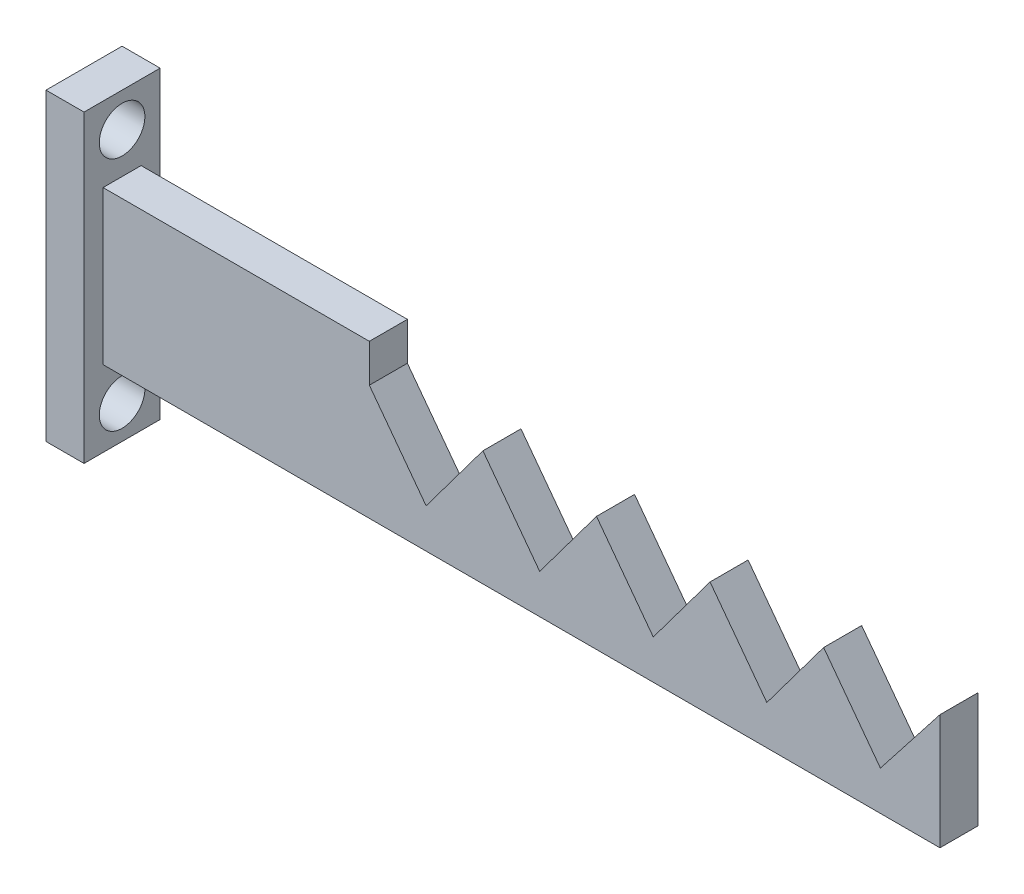
ISO-10303-21;
HEADER;
FILE_DESCRIPTION(('STEP AP214'),'2;1');
FILE_NAME('part.step','',(''),(''),'','','');
FILE_SCHEMA(('AUTOMOTIVE_DESIGN { 1 0 10303 214 1 1 1 1 }'));
ENDSEC;
DATA;
#1=APPLICATION_CONTEXT('core data for automotive mechanical design processes');
#2=APPLICATION_PROTOCOL_DEFINITION('international standard','automotive_design',2000,#1);
#3=PRODUCT_CONTEXT('',#1,'mechanical');
#4=PRODUCT('Part','Part','',(#3));
#5=PRODUCT_RELATED_PRODUCT_CATEGORY('part','',(#4));
#6=PRODUCT_DEFINITION_FORMATION('','',#4);
#7=PRODUCT_DEFINITION_CONTEXT('part definition',#1,'design');
#8=PRODUCT_DEFINITION('design','',#6,#7);
#9=PRODUCT_DEFINITION_SHAPE('','',#8);
#10=(LENGTH_UNIT() NAMED_UNIT(*) SI_UNIT(.MILLI.,.METRE.));
#11=(NAMED_UNIT(*) PLANE_ANGLE_UNIT() SI_UNIT($,.RADIAN.));
#12=(NAMED_UNIT(*) SI_UNIT($,.STERADIAN.) SOLID_ANGLE_UNIT());
#13=UNCERTAINTY_MEASURE_WITH_UNIT(LENGTH_MEASURE(1.E-05),#10,'distance_accuracy_value','');
#14=(GEOMETRIC_REPRESENTATION_CONTEXT(3) GLOBAL_UNCERTAINTY_ASSIGNED_CONTEXT((#13)) GLOBAL_UNIT_ASSIGNED_CONTEXT((#10,
#11,#12)) REPRESENTATION_CONTEXT('',''));
#15=CARTESIAN_POINT('',(0.,0.,0.));
#16=DIRECTION('',(0.,0.,1.));
#17=DIRECTION('',(1.,0.,0.));
#18=AXIS2_PLACEMENT_3D('',#15,#16,#17);
#19=CARTESIAN_POINT('',(-8.89,-2.62039665608065,2.54));
#20=DIRECTION('',(0.,1.,0.));
#21=DIRECTION('',(0.,0.,1.));
#22=AXIS2_PLACEMENT_3D('',#19,#20,#21);
#23=PLANE('',#22);
#24=DIRECTION('',(1.,0.,0.));
#25=VECTOR('',#24,1.);
#26=CARTESIAN_POINT('',(-8.89,-2.62039665608065,0.));
#27=LINE('',#26,#25);
#28=CARTESIAN_POINT('',(-8.89,-2.62039665608065,0.));
#29=VERTEX_POINT('',#28);
#30=CARTESIAN_POINT('',(46.99,-2.62039665608065,0.));
#31=VERTEX_POINT('',#30);
#32=EDGE_CURVE('E184',#29,#31,#27,.T.);
#33=ORIENTED_EDGE('',*,*,#32,.T.);
#34=DIRECTION('',(0.,0.,-1.));
#35=VECTOR('',#34,1.);
#36=CARTESIAN_POINT('',(46.99,-2.62039665608065,2.54));
#37=LINE('',#36,#35);
#38=CARTESIAN_POINT('',(46.99,-2.62039665608065,2.54));
#39=VERTEX_POINT('',#38);
#40=EDGE_CURVE('E53',#39,#31,#37,.T.);
#41=ORIENTED_EDGE('',*,*,#40,.F.);
#42=DIRECTION('',(1.,0.,0.));
#43=VECTOR('',#42,1.);
#44=CARTESIAN_POINT('',(-8.89,-2.62039665608065,2.54));
#45=LINE('',#44,#43);
#46=CARTESIAN_POINT('',(-8.89,-2.62039665608065,2.54));
#47=VERTEX_POINT('',#46);
#48=EDGE_CURVE('E123',#47,#39,#45,.T.);
#49=ORIENTED_EDGE('',*,*,#48,.F.);
#50=DIRECTION('',(0.,0.,-1.));
#51=VECTOR('',#50,1.);
#52=CARTESIAN_POINT('',(-8.89,-2.62039665608065,2.54));
#53=LINE('',#52,#51);
#54=EDGE_CURVE('E11',#47,#29,#53,.T.);
#55=ORIENTED_EDGE('',*,*,#54,.T.);
#56=EDGE_LOOP('',(#33,#41,#49,#55));
#57=FACE_BOUND('',#56,.T.);
#58=ADVANCED_FACE('F44',(#57),#23,.F.);
#59=CARTESIAN_POINT('',(46.99,5.07999999999997,2.54));
#60=DIRECTION('',(-1.,0.,0.));
#61=DIRECTION('',(0.,-1.,0.));
#62=AXIS2_PLACEMENT_3D('',#59,#60,#61);
#63=PLANE('',#62);
#64=DIRECTION('',(0.,1.,0.));
#65=VECTOR('',#64,1.);
#66=CARTESIAN_POINT('',(46.99,5.07999999999997,0.));
#67=LINE('',#66,#65);
#68=CARTESIAN_POINT('',(46.99,5.07999999999997,0.));
#69=VERTEX_POINT('',#68);
#70=EDGE_CURVE('E187',#31,#69,#67,.T.);
#71=ORIENTED_EDGE('',*,*,#70,.T.);
#72=DIRECTION('',(0.,0.,-1.));
#73=VECTOR('',#72,1.);
#74=CARTESIAN_POINT('',(46.99,5.07999999999997,2.54));
#75=LINE('',#74,#73);
#76=CARTESIAN_POINT('',(46.99,5.07999999999997,2.54));
#77=VERTEX_POINT('',#76);
#78=EDGE_CURVE('E271',#77,#69,#75,.T.);
#79=ORIENTED_EDGE('',*,*,#78,.F.);
#80=DIRECTION('',(0.,1.,0.));
#81=VECTOR('',#80,1.);
#82=CARTESIAN_POINT('',(46.99,-2.62039665608065,2.54));
#83=LINE('',#82,#81);
#84=EDGE_CURVE('E278',#39,#77,#83,.T.);
#85=ORIENTED_EDGE('',*,*,#84,.F.);
#86=ORIENTED_EDGE('',*,*,#40,.T.);
#87=EDGE_LOOP('',(#71,#79,#85,#86));
#88=FACE_BOUND('',#87,.T.);
#89=ADVANCED_FACE('F279',(#88),#63,.F.);
#90=CARTESIAN_POINT('',(43.0143949360735,0.,2.54));
#91=DIRECTION('',(0.787508545501685,-0.616303732555483,0.));
#92=DIRECTION('',(0.616303732555483,0.787508545501685,0.));
#93=AXIS2_PLACEMENT_3D('',#90,#91,#92);
#94=PLANE('',#93);
#95=DIRECTION('',(-0.616303732555483,-0.787508545501685,0.));
#96=VECTOR('',#95,1.);
#97=CARTESIAN_POINT('',(43.0143949360735,0.,0.));
#98=LINE('',#97,#96);
#99=CARTESIAN_POINT('',(43.0143949360735,0.,0.));
#100=VERTEX_POINT('',#99);
#101=EDGE_CURVE('E194',#69,#100,#98,.T.);
#102=ORIENTED_EDGE('',*,*,#101,.T.);
#103=DIRECTION('',(0.,0.,-1.));
#104=VECTOR('',#103,1.);
#105=CARTESIAN_POINT('',(43.0143949360735,0.,2.54));
#106=LINE('',#105,#104);
#107=CARTESIAN_POINT('',(43.0143949360735,0.,2.54));
#108=VERTEX_POINT('',#107);
#109=EDGE_CURVE('E270',#108,#100,#106,.T.);
#110=ORIENTED_EDGE('',*,*,#109,.F.);
#111=DIRECTION('',(-0.616303732555483,-0.787508545501685,0.));
#112=VECTOR('',#111,1.);
#113=CARTESIAN_POINT('',(43.0143949360735,0.,2.54));
#114=LINE('',#113,#112);
#115=EDGE_CURVE('E302',#77,#108,#114,.T.);
#116=ORIENTED_EDGE('',*,*,#115,.F.);
#117=ORIENTED_EDGE('',*,*,#78,.T.);
#118=EDGE_LOOP('',(#102,#110,#116,#117));
#119=FACE_BOUND('',#118,.T.);
#120=ADVANCED_FACE('F292',(#119),#94,.F.);
#121=CARTESIAN_POINT('',(39.222795498732,5.07999999999997,2.54));
#122=DIRECTION('',(-0.801391170341021,-0.598140612314069,0.));
#123=DIRECTION('',(0.598140612314069,-0.801391170341021,0.));
#124=AXIS2_PLACEMENT_3D('',#121,#122,#123);
#125=PLANE('',#124);
#126=DIRECTION('',(-0.598140612314069,0.801391170341021,0.));
#127=VECTOR('',#126,1.);
#128=CARTESIAN_POINT('',(39.222795498732,5.07999999999997,0.));
#129=LINE('',#128,#127);
#130=CARTESIAN_POINT('',(39.222795498732,5.07999999999997,0.));
#131=VERTEX_POINT('',#130);
#132=EDGE_CURVE('E193',#100,#131,#129,.T.);
#133=ORIENTED_EDGE('',*,*,#132,.T.);
#134=DIRECTION('',(0.,0.,-1.));
#135=VECTOR('',#134,1.);
#136=CARTESIAN_POINT('',(39.222795498732,5.07999999999997,2.54));
#137=LINE('',#136,#135);
#138=CARTESIAN_POINT('',(39.222795498732,5.07999999999997,2.54));
#139=VERTEX_POINT('',#138);
#140=EDGE_CURVE('E263',#139,#131,#137,.T.);
#141=ORIENTED_EDGE('',*,*,#140,.F.);
#142=DIRECTION('',(-0.598140612314069,0.801391170341021,0.));
#143=VECTOR('',#142,1.);
#144=CARTESIAN_POINT('',(39.222795498732,5.07999999999997,2.54));
#145=LINE('',#144,#143);
#146=EDGE_CURVE('E300',#108,#139,#145,.T.);
#147=ORIENTED_EDGE('',*,*,#146,.F.);
#148=ORIENTED_EDGE('',*,*,#109,.T.);
#149=EDGE_LOOP('',(#133,#141,#147,#148));
#150=FACE_BOUND('',#149,.T.);
#151=ADVANCED_FACE('F293',(#150),#125,.F.);
#152=CARTESIAN_POINT('',(35.4311960613905,0.,2.54));
#153=DIRECTION('',(0.801391170341021,-0.598140612314069,0.));
#154=DIRECTION('',(0.598140612314069,0.801391170341021,0.));
#155=AXIS2_PLACEMENT_3D('',#152,#153,#154);
#156=PLANE('',#155);
#157=DIRECTION('',(-0.598140612314069,-0.801391170341021,0.));
#158=VECTOR('',#157,1.);
#159=CARTESIAN_POINT('',(35.4311960613905,0.,0.));
#160=LINE('',#159,#158);
#161=CARTESIAN_POINT('',(35.4311960613905,0.,0.));
#162=VERTEX_POINT('',#161);
#163=EDGE_CURVE('E196',#131,#162,#160,.T.);
#164=ORIENTED_EDGE('',*,*,#163,.T.);
#165=DIRECTION('',(0.,0.,-1.));
#166=VECTOR('',#165,1.);
#167=CARTESIAN_POINT('',(35.4311960613905,0.,2.54));
#168=LINE('',#167,#166);
#169=CARTESIAN_POINT('',(35.4311960613905,0.,2.54));
#170=VERTEX_POINT('',#169);
#171=EDGE_CURVE('E259',#170,#162,#168,.T.);
#172=ORIENTED_EDGE('',*,*,#171,.F.);
#173=DIRECTION('',(-0.598140612314069,-0.801391170341021,0.));
#174=VECTOR('',#173,1.);
#175=CARTESIAN_POINT('',(35.4311960613905,0.,2.54));
#176=LINE('',#175,#174);
#177=EDGE_CURVE('E299',#139,#170,#176,.T.);
#178=ORIENTED_EDGE('',*,*,#177,.F.);
#179=ORIENTED_EDGE('',*,*,#140,.T.);
#180=EDGE_LOOP('',(#164,#172,#178,#179));
#181=FACE_BOUND('',#180,.T.);
#182=ADVANCED_FACE('F476',(#181),#156,.F.);
#183=CARTESIAN_POINT('',(31.639596624049,5.07999999999997,2.54));
#184=DIRECTION('',(-0.801391170341021,-0.598140612314068,0.));
#185=DIRECTION('',(0.598140612314069,-0.801391170341021,0.));
#186=AXIS2_PLACEMENT_3D('',#183,#184,#185);
#187=PLANE('',#186);
#188=DIRECTION('',(-0.598140612314069,0.801391170341021,0.));
#189=VECTOR('',#188,1.);
#190=CARTESIAN_POINT('',(31.639596624049,5.07999999999997,0.));
#191=LINE('',#190,#189);
#192=CARTESIAN_POINT('',(31.639596624049,5.07999999999997,0.));
#193=VERTEX_POINT('',#192);
#194=EDGE_CURVE('E203',#162,#193,#191,.T.);
#195=ORIENTED_EDGE('',*,*,#194,.T.);
#196=DIRECTION('',(0.,0.,-1.));
#197=VECTOR('',#196,1.);
#198=CARTESIAN_POINT('',(31.639596624049,5.07999999999997,2.54));
#199=LINE('',#198,#197);
#200=CARTESIAN_POINT('',(31.639596624049,5.07999999999997,2.54));
#201=VERTEX_POINT('',#200);
#202=EDGE_CURVE('E254',#201,#193,#199,.T.);
#203=ORIENTED_EDGE('',*,*,#202,.F.);
#204=DIRECTION('',(-0.598140612314069,0.801391170341021,0.));
#205=VECTOR('',#204,1.);
#206=CARTESIAN_POINT('',(31.639596624049,5.07999999999997,2.54));
#207=LINE('',#206,#205);
#208=EDGE_CURVE('E303',#170,#201,#207,.T.);
#209=ORIENTED_EDGE('',*,*,#208,.F.);
#210=ORIENTED_EDGE('',*,*,#171,.T.);
#211=EDGE_LOOP('',(#195,#203,#209,#210));
#212=FACE_BOUND('',#211,.T.);
#213=ADVANCED_FACE('F481',(#212),#187,.F.);
#214=CARTESIAN_POINT('',(27.8479971867075,0.,2.54));
#215=DIRECTION('',(0.801391170341021,-0.598140612314069,0.));
#216=DIRECTION('',(0.598140612314069,0.80139117034102,0.));
#217=AXIS2_PLACEMENT_3D('',#214,#215,#216);
#218=PLANE('',#217);
#219=DIRECTION('',(-0.598140612314069,-0.80139117034102,0.));
#220=VECTOR('',#219,1.);
#221=CARTESIAN_POINT('',(27.8479971867075,0.,0.));
#222=LINE('',#221,#220);
#223=CARTESIAN_POINT('',(27.8479971867075,0.,0.));
#224=VERTEX_POINT('',#223);
#225=EDGE_CURVE('E204',#193,#224,#222,.T.);
#226=ORIENTED_EDGE('',*,*,#225,.T.);
#227=DIRECTION('',(0.,0.,-1.));
#228=VECTOR('',#227,1.);
#229=CARTESIAN_POINT('',(27.8479971867075,0.,2.54));
#230=LINE('',#229,#228);
#231=CARTESIAN_POINT('',(27.8479971867075,0.,2.54));
#232=VERTEX_POINT('',#231);
#233=EDGE_CURVE('E253',#232,#224,#230,.T.);
#234=ORIENTED_EDGE('',*,*,#233,.F.);
#235=DIRECTION('',(-0.598140612314069,-0.80139117034102,0.));
#236=VECTOR('',#235,1.);
#237=CARTESIAN_POINT('',(27.8479971867075,0.,2.54));
#238=LINE('',#237,#236);
#239=EDGE_CURVE('E315',#201,#232,#238,.T.);
#240=ORIENTED_EDGE('',*,*,#239,.F.);
#241=ORIENTED_EDGE('',*,*,#202,.T.);
#242=EDGE_LOOP('',(#226,#234,#240,#241));
#243=FACE_BOUND('',#242,.T.);
#244=ADVANCED_FACE('F484',(#243),#218,.F.);
#245=CARTESIAN_POINT('',(24.056397749366,5.07999999999997,2.54));
#246=DIRECTION('',(-0.801391170341021,-0.598140612314069,0.));
#247=DIRECTION('',(0.598140612314069,-0.801391170341021,0.));
#248=AXIS2_PLACEMENT_3D('',#245,#246,#247);
#249=PLANE('',#248);
#250=DIRECTION('',(-0.598140612314069,0.801391170341021,0.));
#251=VECTOR('',#250,1.);
#252=CARTESIAN_POINT('',(24.056397749366,5.07999999999997,0.));
#253=LINE('',#252,#251);
#254=CARTESIAN_POINT('',(24.056397749366,5.07999999999997,0.));
#255=VERTEX_POINT('',#254);
#256=EDGE_CURVE('E210',#224,#255,#253,.T.);
#257=ORIENTED_EDGE('',*,*,#256,.T.);
#258=DIRECTION('',(0.,0.,-1.));
#259=VECTOR('',#258,1.);
#260=CARTESIAN_POINT('',(24.056397749366,5.07999999999997,2.54));
#261=LINE('',#260,#259);
#262=CARTESIAN_POINT('',(24.056397749366,5.07999999999997,2.54));
#263=VERTEX_POINT('',#262);
#264=EDGE_CURVE('E249',#263,#255,#261,.T.);
#265=ORIENTED_EDGE('',*,*,#264,.F.);
#266=DIRECTION('',(-0.598140612314069,0.801391170341021,0.));
#267=VECTOR('',#266,1.);
#268=CARTESIAN_POINT('',(24.056397749366,5.07999999999997,2.54));
#269=LINE('',#268,#267);
#270=EDGE_CURVE('E312',#232,#263,#269,.T.);
#271=ORIENTED_EDGE('',*,*,#270,.F.);
#272=ORIENTED_EDGE('',*,*,#233,.T.);
#273=EDGE_LOOP('',(#257,#265,#271,#272));
#274=FACE_BOUND('',#273,.T.);
#275=ADVANCED_FACE('F487',(#274),#249,.F.);
#276=CARTESIAN_POINT('',(20.2647983120245,0.,2.54));
#277=DIRECTION('',(0.801391170341021,-0.598140612314068,0.));
#278=DIRECTION('',(0.598140612314068,0.801391170341021,0.));
#279=AXIS2_PLACEMENT_3D('',#276,#277,#278);
#280=PLANE('',#279);
#281=DIRECTION('',(-0.598140612314068,-0.801391170341021,0.));
#282=VECTOR('',#281,1.);
#283=CARTESIAN_POINT('',(20.2647983120245,0.,0.));
#284=LINE('',#283,#282);
#285=CARTESIAN_POINT('',(20.2647983120245,0.,0.));
#286=VERTEX_POINT('',#285);
#287=EDGE_CURVE('E209',#255,#286,#284,.T.);
#288=ORIENTED_EDGE('',*,*,#287,.T.);
#289=DIRECTION('',(0.,0.,-1.));
#290=VECTOR('',#289,1.);
#291=CARTESIAN_POINT('',(20.2647983120245,0.,2.54));
#292=LINE('',#291,#290);
#293=CARTESIAN_POINT('',(20.2647983120245,0.,2.54));
#294=VERTEX_POINT('',#293);
#295=EDGE_CURVE('E242',#294,#286,#292,.T.);
#296=ORIENTED_EDGE('',*,*,#295,.F.);
#297=DIRECTION('',(-0.598140612314068,-0.801391170341021,0.));
#298=VECTOR('',#297,1.);
#299=CARTESIAN_POINT('',(20.2647983120245,0.,2.54));
#300=LINE('',#299,#298);
#301=EDGE_CURVE('E318',#263,#294,#300,.T.);
#302=ORIENTED_EDGE('',*,*,#301,.F.);
#303=ORIENTED_EDGE('',*,*,#264,.T.);
#304=EDGE_LOOP('',(#288,#296,#302,#303));
#305=FACE_BOUND('',#304,.T.);
#306=ADVANCED_FACE('F492',(#305),#280,.F.);
#307=CARTESIAN_POINT('',(16.473198874683,5.07999999999997,2.54));
#308=DIRECTION('',(-0.801391170341021,-0.598140612314069,0.));
#309=DIRECTION('',(0.598140612314069,-0.801391170341021,0.));
#310=AXIS2_PLACEMENT_3D('',#307,#308,#309);
#311=PLANE('',#310);
#312=DIRECTION('',(-0.598140612314069,0.801391170341021,0.));
#313=VECTOR('',#312,1.);
#314=CARTESIAN_POINT('',(16.473198874683,5.07999999999997,0.));
#315=LINE('',#314,#313);
#316=CARTESIAN_POINT('',(16.473198874683,5.07999999999997,0.));
#317=VERTEX_POINT('',#316);
#318=EDGE_CURVE('E213',#286,#317,#315,.T.);
#319=ORIENTED_EDGE('',*,*,#318,.T.);
#320=DIRECTION('',(0.,0.,-1.));
#321=VECTOR('',#320,1.);
#322=CARTESIAN_POINT('',(16.473198874683,5.07999999999997,2.54));
#323=LINE('',#322,#321);
#324=CARTESIAN_POINT('',(16.473198874683,5.07999999999997,2.54));
#325=VERTEX_POINT('',#324);
#326=EDGE_CURVE('E239',#325,#317,#323,.T.);
#327=ORIENTED_EDGE('',*,*,#326,.F.);
#328=DIRECTION('',(-0.598140612314069,0.801391170341021,0.));
#329=VECTOR('',#328,1.);
#330=CARTESIAN_POINT('',(16.473198874683,5.07999999999997,2.54));
#331=LINE('',#330,#329);
#332=EDGE_CURVE('E321',#294,#325,#331,.T.);
#333=ORIENTED_EDGE('',*,*,#332,.F.);
#334=ORIENTED_EDGE('',*,*,#295,.T.);
#335=EDGE_LOOP('',(#319,#327,#333,#334));
#336=FACE_BOUND('',#335,.T.);
#337=ADVANCED_FACE('F328',(#336),#311,.F.);
#338=CARTESIAN_POINT('',(12.6815994373415,0.,2.54));
#339=DIRECTION('',(0.80139117034102,-0.598140612314069,0.));
#340=DIRECTION('',(0.598140612314069,0.80139117034102,0.));
#341=AXIS2_PLACEMENT_3D('',#338,#339,#340);
#342=PLANE('',#341);
#343=DIRECTION('',(-0.598140612314069,-0.80139117034102,0.));
#344=VECTOR('',#343,1.);
#345=CARTESIAN_POINT('',(12.6815994373415,0.,0.));
#346=LINE('',#345,#344);
#347=CARTESIAN_POINT('',(12.6815994373415,0.,0.));
#348=VERTEX_POINT('',#347);
#349=EDGE_CURVE('E216',#317,#348,#346,.T.);
#350=ORIENTED_EDGE('',*,*,#349,.T.);
#351=DIRECTION('',(0.,0.,-1.));
#352=VECTOR('',#351,1.);
#353=CARTESIAN_POINT('',(12.6815994373415,0.,2.54));
#354=LINE('',#353,#352);
#355=CARTESIAN_POINT('',(12.6815994373415,0.,2.54));
#356=VERTEX_POINT('',#355);
#357=EDGE_CURVE('E172',#356,#348,#354,.T.);
#358=ORIENTED_EDGE('',*,*,#357,.F.);
#359=DIRECTION('',(-0.598140612314069,-0.80139117034102,0.));
#360=VECTOR('',#359,1.);
#361=CARTESIAN_POINT('',(12.6815994373415,0.,2.54));
#362=LINE('',#361,#360);
#363=EDGE_CURVE('E167',#325,#356,#362,.T.);
#364=ORIENTED_EDGE('',*,*,#363,.F.);
#365=ORIENTED_EDGE('',*,*,#326,.T.);
#366=EDGE_LOOP('',(#350,#358,#364,#365));
#367=FACE_BOUND('',#366,.T.);
#368=ADVANCED_FACE('F334',(#367),#342,.F.);
#369=CARTESIAN_POINT('',(8.89,5.07999999999996,2.54));
#370=DIRECTION('',(-0.801391170341021,-0.598140612314069,0.));
#371=DIRECTION('',(0.598140612314069,-0.801391170341021,0.));
#372=AXIS2_PLACEMENT_3D('',#369,#370,#371);
#373=PLANE('',#372);
#374=DIRECTION('',(-0.598140612314069,0.801391170341021,0.));
#375=VECTOR('',#374,1.);
#376=CARTESIAN_POINT('',(8.89,5.07999999999996,0.));
#377=LINE('',#376,#375);
#378=CARTESIAN_POINT('',(8.89,5.07999999999996,0.));
#379=VERTEX_POINT('',#378);
#380=EDGE_CURVE('E109',#348,#379,#377,.T.);
#381=ORIENTED_EDGE('',*,*,#380,.T.);
#382=DIRECTION('',(0.,0.,-1.));
#383=VECTOR('',#382,1.);
#384=CARTESIAN_POINT('',(8.89,5.07999999999996,2.54));
#385=LINE('',#384,#383);
#386=CARTESIAN_POINT('',(8.89,5.07999999999996,2.54));
#387=VERTEX_POINT('',#386);
#388=EDGE_CURVE('E168',#387,#379,#385,.T.);
#389=ORIENTED_EDGE('',*,*,#388,.F.);
#390=DIRECTION('',(-0.598140612314069,0.801391170341021,0.));
#391=VECTOR('',#390,1.);
#392=CARTESIAN_POINT('',(8.89,5.07999999999996,2.54));
#393=LINE('',#392,#391);
#394=EDGE_CURVE('E161',#356,#387,#393,.T.);
#395=ORIENTED_EDGE('',*,*,#394,.F.);
#396=ORIENTED_EDGE('',*,*,#357,.T.);
#397=EDGE_LOOP('',(#381,#389,#395,#396));
#398=FACE_BOUND('',#397,.T.);
#399=ADVANCED_FACE('F171',(#398),#373,.F.);
#400=CARTESIAN_POINT('',(8.89,5.07999999999996,2.54));
#401=DIRECTION('',(-1.,0.,0.));
#402=DIRECTION('',(0.,-1.,0.));
#403=AXIS2_PLACEMENT_3D('',#400,#401,#402);
#404=PLANE('',#403);
#405=DIRECTION('',(0.,1.,0.));
#406=VECTOR('',#405,1.);
#407=CARTESIAN_POINT('',(8.89,5.07999999999996,0.));
#408=LINE('',#407,#406);
#409=CARTESIAN_POINT('',(8.89,7.61999999999998,0.));
#410=VERTEX_POINT('',#409);
#411=EDGE_CURVE('E120',#379,#410,#408,.T.);
#412=ORIENTED_EDGE('',*,*,#411,.T.);
#413=DIRECTION('',(0.,0.,-1.));
#414=VECTOR('',#413,1.);
#415=CARTESIAN_POINT('',(8.89,7.61999999999998,2.54));
#416=LINE('',#415,#414);
#417=CARTESIAN_POINT('',(8.89,7.61999999999998,2.54));
#418=VERTEX_POINT('',#417);
#419=EDGE_CURVE('E173',#418,#410,#416,.T.);
#420=ORIENTED_EDGE('',*,*,#419,.F.);
#421=DIRECTION('',(0.,1.,0.));
#422=VECTOR('',#421,1.);
#423=CARTESIAN_POINT('',(8.89,5.07999999999996,2.54));
#424=LINE('',#423,#422);
#425=EDGE_CURVE('E163',#387,#418,#424,.T.);
#426=ORIENTED_EDGE('',*,*,#425,.F.);
#427=ORIENTED_EDGE('',*,*,#388,.T.);
#428=EDGE_LOOP('',(#412,#420,#426,#427));
#429=FACE_BOUND('',#428,.T.);
#430=ADVANCED_FACE('F177',(#429),#404,.F.);
#431=CARTESIAN_POINT('',(-8.89,7.61999999999998,2.54));
#432=DIRECTION('',(0.,-1.,0.));
#433=DIRECTION('',(0.,0.,-1.));
#434=AXIS2_PLACEMENT_3D('',#431,#432,#433);
#435=PLANE('',#434);
#436=DIRECTION('',(-1.,0.,0.));
#437=VECTOR('',#436,1.);
#438=CARTESIAN_POINT('',(-8.89,7.61999999999998,0.));
#439=LINE('',#438,#437);
#440=CARTESIAN_POINT('',(-8.89,7.61999999999998,0.));
#441=VERTEX_POINT('',#440);
#442=EDGE_CURVE('E224',#410,#441,#439,.T.);
#443=ORIENTED_EDGE('',*,*,#442,.T.);
#444=DIRECTION('',(0.,0.,-1.));
#445=VECTOR('',#444,1.);
#446=CARTESIAN_POINT('',(-8.89,7.61999999999998,2.54));
#447=LINE('',#446,#445);
#448=CARTESIAN_POINT('',(-8.89,7.61999999999998,2.54));
#449=VERTEX_POINT('',#448);
#450=EDGE_CURVE('E178',#449,#441,#447,.T.);
#451=ORIENTED_EDGE('',*,*,#450,.F.);
#452=DIRECTION('',(-1.,0.,0.));
#453=VECTOR('',#452,1.);
#454=CARTESIAN_POINT('',(-8.89,7.61999999999998,2.54));
#455=LINE('',#454,#453);
#456=EDGE_CURVE('E65',#418,#449,#455,.T.);
#457=ORIENTED_EDGE('',*,*,#456,.F.);
#458=ORIENTED_EDGE('',*,*,#419,.T.);
#459=EDGE_LOOP('',(#443,#451,#457,#458));
#460=FACE_BOUND('',#459,.T.);
#461=ADVANCED_FACE('F333',(#460),#435,.F.);
#462=CARTESIAN_POINT('',(0.,0.,2.54));
#463=DIRECTION('',(0.,0.,1.));
#464=DIRECTION('',(1.,0.,0.));
#465=AXIS2_PLACEMENT_3D('',#462,#463,#464);
#466=PLANE('',#465);
#467=DIRECTION('',(0.,-1.,0.));
#468=VECTOR('',#467,1.);
#469=CARTESIAN_POINT('',(-8.89,0.,2.54));
#470=LINE('',#469,#468);
#471=EDGE_CURVE('E232',#449,#47,#470,.T.);
#472=ORIENTED_EDGE('',*,*,#471,.T.);
#473=ORIENTED_EDGE('',*,*,#48,.T.);
#474=ORIENTED_EDGE('',*,*,#84,.T.);
#475=ORIENTED_EDGE('',*,*,#115,.T.);
#476=ORIENTED_EDGE('',*,*,#146,.T.);
#477=ORIENTED_EDGE('',*,*,#177,.T.);
#478=ORIENTED_EDGE('',*,*,#208,.T.);
#479=ORIENTED_EDGE('',*,*,#239,.T.);
#480=ORIENTED_EDGE('',*,*,#270,.T.);
#481=ORIENTED_EDGE('',*,*,#301,.T.);
#482=ORIENTED_EDGE('',*,*,#332,.T.);
#483=ORIENTED_EDGE('',*,*,#363,.T.);
#484=ORIENTED_EDGE('',*,*,#394,.T.);
#485=ORIENTED_EDGE('',*,*,#425,.T.);
#486=ORIENTED_EDGE('',*,*,#456,.T.);
#487=EDGE_LOOP('',(#472,#473,#474,#475,#476,#477,#478,#479,#480,#481,#482,#483,#484,#485,#486));
#488=FACE_BOUND('',#487,.T.);
#489=ADVANCED_FACE('F165',(#488),#466,.T.);
#490=CARTESIAN_POINT('',(0.,0.,0.));
#491=DIRECTION('',(0.,0.,1.));
#492=DIRECTION('',(1.,0.,0.));
#493=AXIS2_PLACEMENT_3D('',#490,#491,#492);
#494=PLANE('',#493);
#495=ORIENTED_EDGE('',*,*,#32,.F.);
#496=DIRECTION('',(0.,-1.,0.));
#497=VECTOR('',#496,1.);
#498=CARTESIAN_POINT('',(-8.89,0.,0.));
#499=LINE('',#498,#497);
#500=EDGE_CURVE('E230',#441,#29,#499,.T.);
#501=ORIENTED_EDGE('',*,*,#500,.F.);
#502=ORIENTED_EDGE('',*,*,#442,.F.);
#503=ORIENTED_EDGE('',*,*,#411,.F.);
#504=ORIENTED_EDGE('',*,*,#380,.F.);
#505=ORIENTED_EDGE('',*,*,#349,.F.);
#506=ORIENTED_EDGE('',*,*,#318,.F.);
#507=ORIENTED_EDGE('',*,*,#287,.F.);
#508=ORIENTED_EDGE('',*,*,#256,.F.);
#509=ORIENTED_EDGE('',*,*,#225,.F.);
#510=ORIENTED_EDGE('',*,*,#194,.F.);
#511=ORIENTED_EDGE('',*,*,#163,.F.);
#512=ORIENTED_EDGE('',*,*,#132,.F.);
#513=ORIENTED_EDGE('',*,*,#101,.F.);
#514=ORIENTED_EDGE('',*,*,#70,.F.);
#515=EDGE_LOOP('',(#495,#501,#502,#503,#504,#505,#506,#507,#508,#509,#510,#511,#512,#513,#514));
#516=FACE_BOUND('',#515,.T.);
#517=ADVANCED_FACE('F283',(#516),#494,.F.);
#518=CARTESIAN_POINT('',(-8.89,0.,0.));
#519=DIRECTION('',(-1.,0.,0.));
#520=DIRECTION('',(0.,0.,1.));
#521=AXIS2_PLACEMENT_3D('',#518,#519,#520);
#522=PLANE('',#521);
#523=CARTESIAN_POINT('',(-8.89,10.3336033439194,1.27));
#524=DIRECTION('',(-1.,0.,0.));
#525=DIRECTION('',(0.,0.,1.));
#526=AXIS2_PLACEMENT_3D('',#523,#524,#525);
#527=CIRCLE('',#526,1.524);
#528=CARTESIAN_POINT('',(-8.89,10.3336033439194,2.794));
#529=VERTEX_POINT('',#528);
#530=EDGE_CURVE('E377',#529,#529,#527,.T.);
#531=ORIENTED_EDGE('',*,*,#530,.T.);
#532=EDGE_LOOP('',(#531));
#533=FACE_BOUND('',#532,.T.);
#534=CARTESIAN_POINT('',(-8.89,-5.41439665608065,1.27));
#535=DIRECTION('',(-1.,0.,0.));
#536=DIRECTION('',(0.,0.,-1.));
#537=AXIS2_PLACEMENT_3D('',#534,#535,#536);
#538=CIRCLE('',#537,1.524);
#539=CARTESIAN_POINT('',(-8.89,-5.41439665608065,-0.253999999999998));
#540=VERTEX_POINT('',#539);
#541=EDGE_CURVE('E393',#540,#540,#538,.T.);
#542=ORIENTED_EDGE('',*,*,#541,.T.);
#543=EDGE_LOOP('',(#542));
#544=FACE_BOUND('',#543,.T.);
#545=DIRECTION('',(0.,1.,0.));
#546=VECTOR('',#545,1.);
#547=CARTESIAN_POINT('',(-8.89,12.6196033439194,3.81));
#548=LINE('',#547,#546);
#549=CARTESIAN_POINT('',(-8.89,-7.70039665608065,3.81));
#550=VERTEX_POINT('',#549);
#551=CARTESIAN_POINT('',(-8.89,12.6196033439194,3.81));
#552=VERTEX_POINT('',#551);
#553=EDGE_CURVE('E374',#550,#552,#548,.T.);
#554=ORIENTED_EDGE('',*,*,#553,.F.);
#555=DIRECTION('',(0.,0.,1.));
#556=VECTOR('',#555,1.);
#557=CARTESIAN_POINT('',(-8.89,-7.70039665608065,-1.27));
#558=LINE('',#557,#556);
#559=CARTESIAN_POINT('',(-8.89,-7.70039665608065,-1.27));
#560=VERTEX_POINT('',#559);
#561=EDGE_CURVE('E362',#560,#550,#558,.T.);
#562=ORIENTED_EDGE('',*,*,#561,.F.);
#563=DIRECTION('',(0.,-1.,0.));
#564=VECTOR('',#563,1.);
#565=CARTESIAN_POINT('',(-8.89,12.6196033439194,-1.27));
#566=LINE('',#565,#564);
#567=CARTESIAN_POINT('',(-8.89,12.6196033439194,-1.27));
#568=VERTEX_POINT('',#567);
#569=EDGE_CURVE('E370',#568,#560,#566,.T.);
#570=ORIENTED_EDGE('',*,*,#569,.F.);
#571=DIRECTION('',(0.,0.,-1.));
#572=VECTOR('',#571,1.);
#573=CARTESIAN_POINT('',(-8.89,12.6196033439194,-1.27));
#574=LINE('',#573,#572);
#575=EDGE_CURVE('E371',#552,#568,#574,.T.);
#576=ORIENTED_EDGE('',*,*,#575,.F.);
#577=EDGE_LOOP('',(#554,#562,#570,#576));
#578=FACE_BOUND('',#577,.T.);
#579=ORIENTED_EDGE('',*,*,#450,.T.);
#580=ORIENTED_EDGE('',*,*,#500,.T.);
#581=ORIENTED_EDGE('',*,*,#54,.F.);
#582=ORIENTED_EDGE('',*,*,#471,.F.);
#583=EDGE_LOOP('',(#579,#580,#581,#582));
#584=FACE_BOUND('',#583,.T.);
#585=ADVANCED_FACE('F338',(#533,#544,#578,#584),#522,.F.);
#586=CARTESIAN_POINT('',(-11.43,12.6196033439194,3.81));
#587=DIRECTION('',(0.,0.,-1.));
#588=DIRECTION('',(0.,1.,0.));
#589=AXIS2_PLACEMENT_3D('',#586,#587,#588);
#590=PLANE('',#589);
#591=ORIENTED_EDGE('',*,*,#553,.T.);
#592=DIRECTION('',(1.,0.,0.));
#593=VECTOR('',#592,1.);
#594=CARTESIAN_POINT('',(-11.43,12.6196033439194,3.81));
#595=LINE('',#594,#593);
#596=CARTESIAN_POINT('',(-11.43,12.6196033439194,3.81));
#597=VERTEX_POINT('',#596);
#598=EDGE_CURVE('E188',#597,#552,#595,.T.);
#599=ORIENTED_EDGE('',*,*,#598,.F.);
#600=DIRECTION('',(0.,1.,0.));
#601=VECTOR('',#600,1.);
#602=CARTESIAN_POINT('',(-11.43,12.6196033439194,3.81));
#603=LINE('',#602,#601);
#604=CARTESIAN_POINT('',(-11.43,-7.70039665608065,3.81));
#605=VERTEX_POINT('',#604);
#606=EDGE_CURVE('E368',#605,#597,#603,.T.);
#607=ORIENTED_EDGE('',*,*,#606,.F.);
#608=DIRECTION('',(1.,0.,0.));
#609=VECTOR('',#608,1.);
#610=CARTESIAN_POINT('',(-11.43,-7.70039665608065,3.81));
#611=LINE('',#610,#609);
#612=EDGE_CURVE('E359',#605,#550,#611,.T.);
#613=ORIENTED_EDGE('',*,*,#612,.T.);
#614=EDGE_LOOP('',(#591,#599,#607,#613));
#615=FACE_BOUND('',#614,.T.);
#616=ADVANCED_FACE('F440',(#615),#590,.F.);
#617=CARTESIAN_POINT('',(-11.43,12.6196033439194,-1.27));
#618=DIRECTION('',(0.,-1.,0.));
#619=DIRECTION('',(0.,0.,-1.));
#620=AXIS2_PLACEMENT_3D('',#617,#618,#619);
#621=PLANE('',#620);
#622=ORIENTED_EDGE('',*,*,#575,.T.);
#623=DIRECTION('',(1.,0.,0.));
#624=VECTOR('',#623,1.);
#625=CARTESIAN_POINT('',(-11.43,12.6196033439194,-1.27));
#626=LINE('',#625,#624);
#627=CARTESIAN_POINT('',(-11.43,12.6196033439194,-1.27));
#628=VERTEX_POINT('',#627);
#629=EDGE_CURVE('E349',#628,#568,#626,.T.);
#630=ORIENTED_EDGE('',*,*,#629,.F.);
#631=DIRECTION('',(0.,0.,-1.));
#632=VECTOR('',#631,1.);
#633=CARTESIAN_POINT('',(-11.43,12.6196033439194,-1.27));
#634=LINE('',#633,#632);
#635=EDGE_CURVE('E390',#597,#628,#634,.T.);
#636=ORIENTED_EDGE('',*,*,#635,.F.);
#637=ORIENTED_EDGE('',*,*,#598,.T.);
#638=EDGE_LOOP('',(#622,#630,#636,#637));
#639=FACE_BOUND('',#638,.T.);
#640=ADVANCED_FACE('F442',(#639),#621,.F.);
#641=CARTESIAN_POINT('',(-11.43,12.6196033439194,-1.27));
#642=DIRECTION('',(0.,0.,1.));
#643=DIRECTION('',(0.,-1.,0.));
#644=AXIS2_PLACEMENT_3D('',#641,#642,#643);
#645=PLANE('',#644);
#646=ORIENTED_EDGE('',*,*,#569,.T.);
#647=DIRECTION('',(1.,0.,0.));
#648=VECTOR('',#647,1.);
#649=CARTESIAN_POINT('',(-11.43,-7.70039665608065,-1.27));
#650=LINE('',#649,#648);
#651=CARTESIAN_POINT('',(-11.43,-7.70039665608065,-1.27));
#652=VERTEX_POINT('',#651);
#653=EDGE_CURVE('E352',#652,#560,#650,.T.);
#654=ORIENTED_EDGE('',*,*,#653,.F.);
#655=DIRECTION('',(0.,-1.,0.));
#656=VECTOR('',#655,1.);
#657=CARTESIAN_POINT('',(-11.43,12.6196033439194,-1.27));
#658=LINE('',#657,#656);
#659=EDGE_CURVE('E382',#628,#652,#658,.T.);
#660=ORIENTED_EDGE('',*,*,#659,.F.);
#661=ORIENTED_EDGE('',*,*,#629,.T.);
#662=EDGE_LOOP('',(#646,#654,#660,#661));
#663=FACE_BOUND('',#662,.T.);
#664=ADVANCED_FACE('F508',(#663),#645,.F.);
#665=CARTESIAN_POINT('',(-11.43,-7.70039665608065,-1.27));
#666=DIRECTION('',(0.,1.,0.));
#667=DIRECTION('',(0.,0.,1.));
#668=AXIS2_PLACEMENT_3D('',#665,#666,#667);
#669=PLANE('',#668);
#670=ORIENTED_EDGE('',*,*,#561,.T.);
#671=ORIENTED_EDGE('',*,*,#612,.F.);
#672=DIRECTION('',(0.,0.,1.));
#673=VECTOR('',#672,1.);
#674=CARTESIAN_POINT('',(-11.43,-7.70039665608065,-1.27));
#675=LINE('',#674,#673);
#676=EDGE_CURVE('E363',#652,#605,#675,.T.);
#677=ORIENTED_EDGE('',*,*,#676,.F.);
#678=ORIENTED_EDGE('',*,*,#653,.T.);
#679=EDGE_LOOP('',(#670,#671,#677,#678));
#680=FACE_BOUND('',#679,.T.);
#681=ADVANCED_FACE('F425',(#680),#669,.F.);
#682=CARTESIAN_POINT('',(-11.43,0.,0.));
#683=DIRECTION('',(-1.,0.,0.));
#684=DIRECTION('',(0.,0.,1.));
#685=AXIS2_PLACEMENT_3D('',#682,#683,#684);
#686=PLANE('',#685);
#687=CARTESIAN_POINT('',(-11.43,10.3336033439194,1.27));
#688=DIRECTION('',(-1.,0.,0.));
#689=DIRECTION('',(0.,0.,1.));
#690=AXIS2_PLACEMENT_3D('',#687,#688,#689);
#691=CIRCLE('',#690,1.524);
#692=CARTESIAN_POINT('',(-11.43,10.3336033439194,2.794));
#693=VERTEX_POINT('',#692);
#694=EDGE_CURVE('E405',#693,#693,#691,.T.);
#695=ORIENTED_EDGE('',*,*,#694,.F.);
#696=EDGE_LOOP('',(#695));
#697=FACE_BOUND('',#696,.T.);
#698=CARTESIAN_POINT('',(-11.43,-5.41439665608065,1.27));
#699=DIRECTION('',(-1.,0.,0.));
#700=DIRECTION('',(0.,0.,-1.));
#701=AXIS2_PLACEMENT_3D('',#698,#699,#700);
#702=CIRCLE('',#701,1.524);
#703=CARTESIAN_POINT('',(-11.43,-5.41439665608065,-0.253999999999998));
#704=VERTEX_POINT('',#703);
#705=EDGE_CURVE('E400',#704,#704,#702,.T.);
#706=ORIENTED_EDGE('',*,*,#705,.F.);
#707=EDGE_LOOP('',(#706));
#708=FACE_BOUND('',#707,.T.);
#709=ORIENTED_EDGE('',*,*,#606,.T.);
#710=ORIENTED_EDGE('',*,*,#635,.T.);
#711=ORIENTED_EDGE('',*,*,#659,.T.);
#712=ORIENTED_EDGE('',*,*,#676,.T.);
#713=EDGE_LOOP('',(#709,#710,#711,#712));
#714=FACE_BOUND('',#713,.T.);
#715=ADVANCED_FACE('F420',(#697,#708,#714),#686,.T.);
#716=CARTESIAN_POINT('',(-8.89,-5.41439665608065,1.27));
#717=DIRECTION('',(-1.,0.,0.));
#718=DIRECTION('',(0.,0.,1.));
#719=AXIS2_PLACEMENT_3D('',#716,#717,#718);
#720=CYLINDRICAL_SURFACE('',#719,1.524);
#721=ORIENTED_EDGE('',*,*,#541,.F.);
#722=EDGE_LOOP('',(#721));
#723=FACE_BOUND('',#722,.T.);
#724=ORIENTED_EDGE('',*,*,#705,.T.);
#725=EDGE_LOOP('',(#724));
#726=FACE_BOUND('',#725,.T.);
#727=ADVANCED_FACE('F413',(#723,#726),#720,.F.);
#728=CARTESIAN_POINT('',(-8.89,10.3336033439194,1.27));
#729=DIRECTION('',(-1.,0.,0.));
#730=DIRECTION('',(0.,0.,1.));
#731=AXIS2_PLACEMENT_3D('',#728,#729,#730);
#732=CYLINDRICAL_SURFACE('',#731,1.524);
#733=ORIENTED_EDGE('',*,*,#530,.F.);
#734=EDGE_LOOP('',(#733));
#735=FACE_BOUND('',#734,.T.);
#736=ORIENTED_EDGE('',*,*,#694,.T.);
#737=EDGE_LOOP('',(#736));
#738=FACE_BOUND('',#737,.T.);
#739=ADVANCED_FACE('F414',(#735,#738),#732,.F.);
#740=CLOSED_SHELL('',(#58,#89,#120,#151,#182,#213,#244,#275,#306,#337,#368,#399,#430,#461,#489,
#517,#585,#616,#640,#664,#681,#715,#727,#739));
#741=MANIFOLD_SOLID_BREP('B2',#740);
#742=ADVANCED_BREP_SHAPE_REPRESENTATION('',(#18,#741),#14);
#743=SHAPE_DEFINITION_REPRESENTATION(#9,#742);
ENDSEC;
END-ISO-10303-21;
